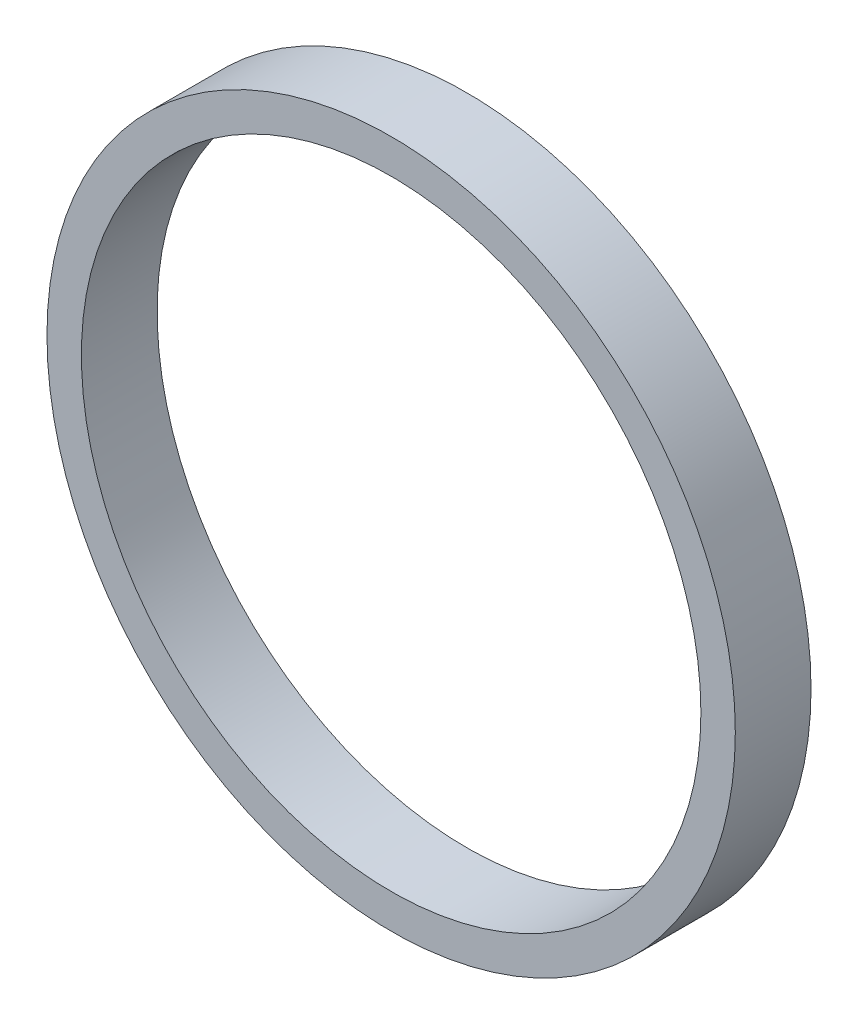
ISO-10303-21;
HEADER;
FILE_DESCRIPTION(('STEP AP214'),'2;1');
FILE_NAME('part.step','',(''),(''),'','','');
FILE_SCHEMA(('AUTOMOTIVE_DESIGN { 1 0 10303 214 1 1 1 1 }'));
ENDSEC;
DATA;
#1=APPLICATION_CONTEXT('core data for automotive mechanical design processes');
#2=APPLICATION_PROTOCOL_DEFINITION('international standard','automotive_design',2000,#1);
#3=PRODUCT_CONTEXT('',#1,'mechanical');
#4=PRODUCT('Part','Part','',(#3));
#5=PRODUCT_RELATED_PRODUCT_CATEGORY('part','',(#4));
#6=PRODUCT_DEFINITION_FORMATION('','',#4);
#7=PRODUCT_DEFINITION_CONTEXT('part definition',#1,'design');
#8=PRODUCT_DEFINITION('design','',#6,#7);
#9=PRODUCT_DEFINITION_SHAPE('','',#8);
#10=(LENGTH_UNIT() NAMED_UNIT(*) SI_UNIT(.MILLI.,.METRE.));
#11=(NAMED_UNIT(*) PLANE_ANGLE_UNIT() SI_UNIT($,.RADIAN.));
#12=(NAMED_UNIT(*) SI_UNIT($,.STERADIAN.) SOLID_ANGLE_UNIT());
#13=UNCERTAINTY_MEASURE_WITH_UNIT(LENGTH_MEASURE(1.E-05),#10,'distance_accuracy_value','');
#14=(GEOMETRIC_REPRESENTATION_CONTEXT(3) GLOBAL_UNCERTAINTY_ASSIGNED_CONTEXT((#13)) GLOBAL_UNIT_ASSIGNED_CONTEXT((#10,
#11,#12)) REPRESENTATION_CONTEXT('',''));
#15=CARTESIAN_POINT('',(0.,0.,0.));
#16=DIRECTION('',(0.,0.,1.));
#17=DIRECTION('',(1.,0.,0.));
#18=AXIS2_PLACEMENT_3D('',#15,#16,#17);
#19=CARTESIAN_POINT('',(0.,0.,11.));
#20=DIRECTION('',(0.,0.,-1.));
#21=DIRECTION('',(-1.,0.,0.));
#22=AXIS2_PLACEMENT_3D('',#19,#20,#21);
#23=CYLINDRICAL_SURFACE('',#22,50.);
#24=CARTESIAN_POINT('',(0.,0.,11.));
#25=DIRECTION('',(0.,0.,1.));
#26=DIRECTION('',(1.,0.,0.));
#27=AXIS2_PLACEMENT_3D('',#24,#25,#26);
#28=CIRCLE('',#27,50.);
#29=CARTESIAN_POINT('',(50.,0.,11.));
#30=VERTEX_POINT('',#29);
#31=EDGE_CURVE('E10',#30,#30,#28,.T.);
#32=ORIENTED_EDGE('',*,*,#31,.F.);
#33=EDGE_LOOP('',(#32));
#34=FACE_BOUND('',#33,.T.);
#35=CARTESIAN_POINT('',(0.,0.,0.));
#36=DIRECTION('',(0.,0.,1.));
#37=DIRECTION('',(1.,0.,0.));
#38=AXIS2_PLACEMENT_3D('',#35,#36,#37);
#39=CIRCLE('',#38,50.);
#40=CARTESIAN_POINT('',(50.,0.,0.));
#41=VERTEX_POINT('',#40);
#42=EDGE_CURVE('E35',#41,#41,#39,.T.);
#43=ORIENTED_EDGE('',*,*,#42,.T.);
#44=EDGE_LOOP('',(#43));
#45=FACE_BOUND('',#44,.T.);
#46=ADVANCED_FACE('F32',(#34,#45),#23,.T.);
#47=CARTESIAN_POINT('',(0.,0.,11.));
#48=DIRECTION('',(0.,0.,1.));
#49=DIRECTION('',(1.,0.,0.));
#50=AXIS2_PLACEMENT_3D('',#47,#48,#49);
#51=PLANE('',#50);
#52=CARTESIAN_POINT('',(0.,0.,11.));
#53=DIRECTION('',(0.,0.,1.));
#54=DIRECTION('',(1.,0.,0.));
#55=AXIS2_PLACEMENT_3D('',#52,#53,#54);
#56=CIRCLE('',#55,45.);
#57=CARTESIAN_POINT('',(45.,0.,11.));
#58=VERTEX_POINT('',#57);
#59=EDGE_CURVE('E42',#58,#58,#56,.T.);
#60=ORIENTED_EDGE('',*,*,#59,.F.);
#61=EDGE_LOOP('',(#60));
#62=FACE_BOUND('',#61,.T.);
#63=ORIENTED_EDGE('',*,*,#31,.T.);
#64=EDGE_LOOP('',(#63));
#65=FACE_BOUND('',#64,.T.);
#66=ADVANCED_FACE('F60',(#62,#65),#51,.T.);
#67=CARTESIAN_POINT('',(0.,0.,0.));
#68=DIRECTION('',(0.,0.,1.));
#69=DIRECTION('',(1.,0.,0.));
#70=AXIS2_PLACEMENT_3D('',#67,#68,#69);
#71=PLANE('',#70);
#72=CARTESIAN_POINT('',(0.,0.,0.));
#73=DIRECTION('',(0.,0.,1.));
#74=DIRECTION('',(1.,0.,0.));
#75=AXIS2_PLACEMENT_3D('',#72,#73,#74);
#76=CIRCLE('',#75,45.);
#77=CARTESIAN_POINT('',(45.,0.,0.));
#78=VERTEX_POINT('',#77);
#79=EDGE_CURVE('E46',#78,#78,#76,.T.);
#80=ORIENTED_EDGE('',*,*,#79,.T.);
#81=EDGE_LOOP('',(#80));
#82=FACE_BOUND('',#81,.T.);
#83=ORIENTED_EDGE('',*,*,#42,.F.);
#84=EDGE_LOOP('',(#83));
#85=FACE_BOUND('',#84,.T.);
#86=ADVANCED_FACE('F50',(#82,#85),#71,.F.);
#87=CARTESIAN_POINT('',(0.,0.,0.));
#88=DIRECTION('',(0.,0.,1.));
#89=DIRECTION('',(1.,0.,0.));
#90=AXIS2_PLACEMENT_3D('',#87,#88,#89);
#91=CYLINDRICAL_SURFACE('',#90,45.);
#92=ORIENTED_EDGE('',*,*,#59,.T.);
#93=EDGE_LOOP('',(#92));
#94=FACE_BOUND('',#93,.T.);
#95=ORIENTED_EDGE('',*,*,#79,.F.);
#96=EDGE_LOOP('',(#95));
#97=FACE_BOUND('',#96,.T.);
#98=ADVANCED_FACE('F53',(#94,#97),#91,.F.);
#99=CLOSED_SHELL('',(#46,#66,#86,#98));
#100=MANIFOLD_SOLID_BREP('B2',#99);
#101=ADVANCED_BREP_SHAPE_REPRESENTATION('',(#18,#100),#14);
#102=SHAPE_DEFINITION_REPRESENTATION(#9,#101);
ENDSEC;
END-ISO-10303-21;
